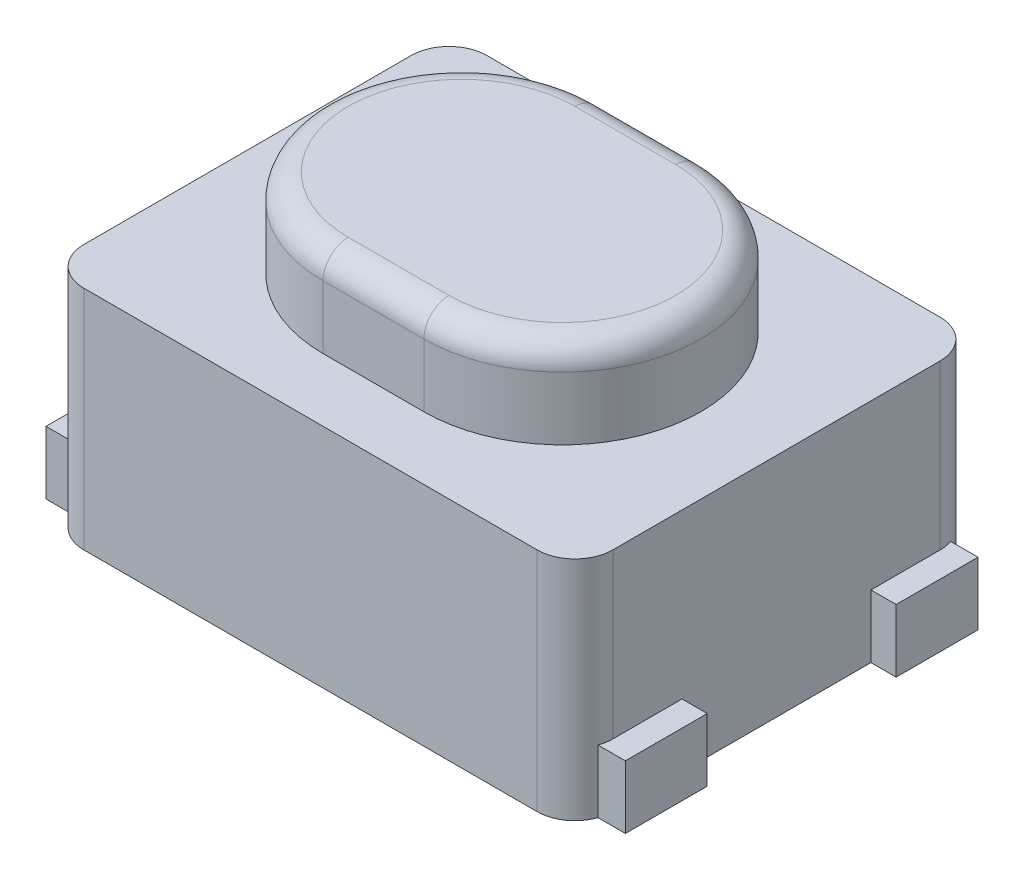
ISO-10303-21;
HEADER;
FILE_DESCRIPTION(('STEP AP214'),'2;1');
FILE_NAME('part.step','',(''),(''),'','','');
FILE_SCHEMA(('AUTOMOTIVE_DESIGN { 1 0 10303 214 1 1 1 1 }'));
ENDSEC;
DATA;
#1=APPLICATION_CONTEXT('core data for automotive mechanical design processes');
#2=APPLICATION_PROTOCOL_DEFINITION('international standard','automotive_design',2000,#1);
#3=PRODUCT_CONTEXT('',#1,'mechanical');
#4=PRODUCT('Part','Part','',(#3));
#5=PRODUCT_RELATED_PRODUCT_CATEGORY('part','',(#4));
#6=PRODUCT_DEFINITION_FORMATION('','',#4);
#7=PRODUCT_DEFINITION_CONTEXT('part definition',#1,'design');
#8=PRODUCT_DEFINITION('design','',#6,#7);
#9=PRODUCT_DEFINITION_SHAPE('','',#8);
#10=(LENGTH_UNIT() NAMED_UNIT(*) SI_UNIT(.MILLI.,.METRE.));
#11=(NAMED_UNIT(*) PLANE_ANGLE_UNIT() SI_UNIT($,.RADIAN.));
#12=(NAMED_UNIT(*) SI_UNIT($,.STERADIAN.) SOLID_ANGLE_UNIT());
#13=UNCERTAINTY_MEASURE_WITH_UNIT(LENGTH_MEASURE(1.E-05),#10,'distance_accuracy_value','');
#14=(GEOMETRIC_REPRESENTATION_CONTEXT(3) GLOBAL_UNCERTAINTY_ASSIGNED_CONTEXT((#13)) GLOBAL_UNIT_ASSIGNED_CONTEXT((#10,
#11,#12)) REPRESENTATION_CONTEXT('',''));
#15=CARTESIAN_POINT('',(0.,0.,0.));
#16=DIRECTION('',(0.,0.,1.));
#17=DIRECTION('',(1.,0.,0.));
#18=AXIS2_PLACEMENT_3D('',#15,#16,#17);
#19=CARTESIAN_POINT('',(2.1,1.8,-1.3));
#20=DIRECTION('',(-1.,0.,0.));
#21=DIRECTION('',(0.,0.,1.));
#22=AXIS2_PLACEMENT_3D('',#19,#20,#21);
#23=PLANE('',#22);
#24=DIRECTION('',(0.,1.,0.));
#25=VECTOR('',#24,1.);
#26=CARTESIAN_POINT('',(2.1,1.8,0.75));
#27=LINE('',#26,#25);
#28=CARTESIAN_POINT('',(2.1,0.,0.75));
#29=VERTEX_POINT('',#28);
#30=CARTESIAN_POINT('',(2.1,0.5,0.75));
#31=VERTEX_POINT('',#30);
#32=EDGE_CURVE('E319',#29,#31,#27,.T.);
#33=ORIENTED_EDGE('',*,*,#32,.F.);
#34=DIRECTION('',(0.,0.,-1.));
#35=VECTOR('',#34,1.);
#36=CARTESIAN_POINT('',(2.1,0.,-1.3));
#37=LINE('',#36,#35);
#38=CARTESIAN_POINT('',(2.1,0.,-0.75));
#39=VERTEX_POINT('',#38);
#40=EDGE_CURVE('E402',#29,#39,#37,.T.);
#41=ORIENTED_EDGE('',*,*,#40,.T.);
#42=DIRECTION('',(0.,-1.,0.));
#43=VECTOR('',#42,1.);
#44=CARTESIAN_POINT('',(2.1,1.8,-0.75));
#45=LINE('',#44,#43);
#46=CARTESIAN_POINT('',(2.1,0.5,-0.75));
#47=VERTEX_POINT('',#46);
#48=EDGE_CURVE('E347',#47,#39,#45,.T.);
#49=ORIENTED_EDGE('',*,*,#48,.F.);
#50=DIRECTION('',(0.,0.,-1.));
#51=VECTOR('',#50,1.);
#52=CARTESIAN_POINT('',(2.1,0.5,-1.3));
#53=LINE('',#52,#51);
#54=CARTESIAN_POINT('',(2.1,0.5,-1.3));
#55=VERTEX_POINT('',#54);
#56=EDGE_CURVE('E353',#47,#55,#53,.T.);
#57=ORIENTED_EDGE('',*,*,#56,.T.);
#58=DIRECTION('',(0.,-1.,0.));
#59=VECTOR('',#58,1.);
#60=CARTESIAN_POINT('',(2.1,1.8,-1.3));
#61=LINE('',#60,#59);
#62=CARTESIAN_POINT('',(2.1,1.8,-1.3));
#63=VERTEX_POINT('',#62);
#64=EDGE_CURVE('E421',#63,#55,#61,.T.);
#65=ORIENTED_EDGE('',*,*,#64,.F.);
#66=DIRECTION('',(0.,0.,-1.));
#67=VECTOR('',#66,1.);
#68=CARTESIAN_POINT('',(2.1,1.8,-1.3));
#69=LINE('',#68,#67);
#70=CARTESIAN_POINT('',(2.1,1.8,1.3));
#71=VERTEX_POINT('',#70);
#72=EDGE_CURVE('E386',#71,#63,#69,.T.);
#73=ORIENTED_EDGE('',*,*,#72,.F.);
#74=DIRECTION('',(0.,-1.,0.));
#75=VECTOR('',#74,1.);
#76=CARTESIAN_POINT('',(2.1,1.8,1.3));
#77=LINE('',#76,#75);
#78=CARTESIAN_POINT('',(2.1,0.5,1.3));
#79=VERTEX_POINT('',#78);
#80=EDGE_CURVE('E424',#71,#79,#77,.T.);
#81=ORIENTED_EDGE('',*,*,#80,.T.);
#82=DIRECTION('',(0.,0.,1.));
#83=VECTOR('',#82,1.);
#84=CARTESIAN_POINT('',(2.1,0.5,-1.3));
#85=LINE('',#84,#83);
#86=EDGE_CURVE('E322',#31,#79,#85,.T.);
#87=ORIENTED_EDGE('',*,*,#86,.F.);
#88=EDGE_LOOP('',(#33,#41,#49,#57,#65,#73,#81,#87));
#89=FACE_BOUND('',#88,.T.);
#90=ADVANCED_FACE('F34',(#89),#23,.F.);
#91=CARTESIAN_POINT('',(1.8,1.8,1.3));
#92=DIRECTION('',(0.,-1.,0.));
#93=DIRECTION('',(0.,0.,-1.));
#94=AXIS2_PLACEMENT_3D('',#91,#92,#93);
#95=CYLINDRICAL_SURFACE('',#94,0.299999999999999);
#96=DIRECTION('',(0.,-1.,0.));
#97=VECTOR('',#96,1.);
#98=CARTESIAN_POINT('',(2.08284271247462,1.8,1.4));
#99=LINE('',#98,#97);
#100=CARTESIAN_POINT('',(2.08284271247462,0.5,1.4));
#101=VERTEX_POINT('',#100);
#102=CARTESIAN_POINT('',(2.08284271247462,0.,1.4));
#103=VERTEX_POINT('',#102);
#104=EDGE_CURVE('E316',#101,#103,#99,.T.);
#105=ORIENTED_EDGE('',*,*,#104,.F.);
#106=CARTESIAN_POINT('',(1.8,0.5,1.3));
#107=DIRECTION('',(0.,-1.,0.));
#108=DIRECTION('',(0.,0.,-1.));
#109=AXIS2_PLACEMENT_3D('',#106,#107,#108);
#110=CIRCLE('',#109,0.299999999999999);
#111=EDGE_CURVE('E461',#79,#101,#110,.T.);
#112=ORIENTED_EDGE('',*,*,#111,.F.);
#113=ORIENTED_EDGE('',*,*,#80,.F.);
#114=CARTESIAN_POINT('',(1.8,1.8,1.3));
#115=DIRECTION('',(0.,1.,0.));
#116=DIRECTION('',(0.,0.,1.));
#117=AXIS2_PLACEMENT_3D('',#114,#115,#116);
#118=CIRCLE('',#117,0.299999999999999);
#119=CARTESIAN_POINT('',(1.8,1.8,1.6));
#120=VERTEX_POINT('',#119);
#121=EDGE_CURVE('E384',#120,#71,#118,.T.);
#122=ORIENTED_EDGE('',*,*,#121,.F.);
#123=DIRECTION('',(0.,-1.,0.));
#124=VECTOR('',#123,1.);
#125=CARTESIAN_POINT('',(1.8,1.8,1.6));
#126=LINE('',#125,#124);
#127=CARTESIAN_POINT('',(1.8,0.,1.6));
#128=VERTEX_POINT('',#127);
#129=EDGE_CURVE('E427',#120,#128,#126,.T.);
#130=ORIENTED_EDGE('',*,*,#129,.T.);
#131=CARTESIAN_POINT('',(1.8,0.,1.3));
#132=DIRECTION('',(0.,1.,0.));
#133=DIRECTION('',(0.,0.,1.));
#134=AXIS2_PLACEMENT_3D('',#131,#132,#133);
#135=CIRCLE('',#134,0.299999999999999);
#136=EDGE_CURVE('E400',#128,#103,#135,.T.);
#137=ORIENTED_EDGE('',*,*,#136,.T.);
#138=EDGE_LOOP('',(#105,#112,#113,#122,#130,#137));
#139=FACE_BOUND('',#138,.T.);
#140=ADVANCED_FACE('F535',(#139),#95,.T.);
#141=CARTESIAN_POINT('',(1.8,1.8,-1.3));
#142=DIRECTION('',(0.,-1.,0.));
#143=DIRECTION('',(0.,0.,-1.));
#144=AXIS2_PLACEMENT_3D('',#141,#142,#143);
#145=CYLINDRICAL_SURFACE('',#144,0.299999999999999);
#146=DIRECTION('',(0.,-1.,0.));
#147=VECTOR('',#146,1.);
#148=CARTESIAN_POINT('',(2.08284271247462,1.8,-1.4));
#149=LINE('',#148,#147);
#150=CARTESIAN_POINT('',(2.08284271247462,0.,-1.4));
#151=VERTEX_POINT('',#150);
#152=CARTESIAN_POINT('',(2.08284271247462,0.5,-1.4));
#153=VERTEX_POINT('',#152);
#154=EDGE_CURVE('E350',#151,#153,#149,.F.);
#155=ORIENTED_EDGE('',*,*,#154,.F.);
#156=CARTESIAN_POINT('',(1.8,0.,-1.3));
#157=DIRECTION('',(0.,1.,0.));
#158=DIRECTION('',(0.,0.,-1.));
#159=AXIS2_PLACEMENT_3D('',#156,#157,#158);
#160=CIRCLE('',#159,0.299999999999999);
#161=CARTESIAN_POINT('',(1.8,0.,-1.6));
#162=VERTEX_POINT('',#161);
#163=EDGE_CURVE('E404',#151,#162,#160,.T.);
#164=ORIENTED_EDGE('',*,*,#163,.T.);
#165=DIRECTION('',(0.,-1.,0.));
#166=VECTOR('',#165,1.);
#167=CARTESIAN_POINT('',(1.8,1.8,-1.6));
#168=LINE('',#167,#166);
#169=CARTESIAN_POINT('',(1.8,1.8,-1.6));
#170=VERTEX_POINT('',#169);
#171=EDGE_CURVE('E418',#170,#162,#168,.T.);
#172=ORIENTED_EDGE('',*,*,#171,.F.);
#173=CARTESIAN_POINT('',(1.8,1.8,-1.3));
#174=DIRECTION('',(0.,1.,0.));
#175=DIRECTION('',(0.,0.,-1.));
#176=AXIS2_PLACEMENT_3D('',#173,#174,#175);
#177=CIRCLE('',#176,0.299999999999999);
#178=EDGE_CURVE('E388',#63,#170,#177,.T.);
#179=ORIENTED_EDGE('',*,*,#178,.F.);
#180=ORIENTED_EDGE('',*,*,#64,.T.);
#181=CARTESIAN_POINT('',(1.8,0.5,-1.3));
#182=DIRECTION('',(0.,1.,0.));
#183=DIRECTION('',(0.,0.,1.));
#184=AXIS2_PLACEMENT_3D('',#181,#182,#183);
#185=CIRCLE('',#184,0.299999999999999);
#186=EDGE_CURVE('E451',#55,#153,#185,.T.);
#187=ORIENTED_EDGE('',*,*,#186,.T.);
#188=EDGE_LOOP('',(#155,#164,#172,#179,#180,#187));
#189=FACE_BOUND('',#188,.T.);
#190=ADVANCED_FACE('F501',(#189),#145,.T.);
#191=CARTESIAN_POINT('',(-1.8,1.8,1.3));
#192=DIRECTION('',(0.,1.,0.));
#193=DIRECTION('',(0.,0.,1.));
#194=AXIS2_PLACEMENT_3D('',#191,#192,#193);
#195=PLANE('',#194);
#196=CARTESIAN_POINT('',(-1.8,1.8,1.3));
#197=DIRECTION('',(0.,1.,0.));
#198=DIRECTION('',(0.,0.,1.));
#199=AXIS2_PLACEMENT_3D('',#196,#197,#198);
#200=CIRCLE('',#199,0.299999999999999);
#201=CARTESIAN_POINT('',(-2.1,1.8,1.3));
#202=VERTEX_POINT('',#201);
#203=CARTESIAN_POINT('',(-1.8,1.8,1.6));
#204=VERTEX_POINT('',#203);
#205=EDGE_CURVE('E378',#202,#204,#200,.T.);
#206=ORIENTED_EDGE('',*,*,#205,.T.);
#207=DIRECTION('',(1.,0.,0.));
#208=VECTOR('',#207,1.);
#209=CARTESIAN_POINT('',(-1.8,1.8,1.6));
#210=LINE('',#209,#208);
#211=EDGE_CURVE('E381',#204,#120,#210,.T.);
#212=ORIENTED_EDGE('',*,*,#211,.T.);
#213=ORIENTED_EDGE('',*,*,#121,.T.);
#214=ORIENTED_EDGE('',*,*,#72,.T.);
#215=ORIENTED_EDGE('',*,*,#178,.T.);
#216=DIRECTION('',(-1.,0.,0.));
#217=VECTOR('',#216,1.);
#218=CARTESIAN_POINT('',(-1.8,1.8,-1.6));
#219=LINE('',#218,#217);
#220=CARTESIAN_POINT('',(-1.8,1.8,-1.6));
#221=VERTEX_POINT('',#220);
#222=EDGE_CURVE('E390',#170,#221,#219,.T.);
#223=ORIENTED_EDGE('',*,*,#222,.T.);
#224=CARTESIAN_POINT('',(-1.8,1.8,-1.3));
#225=DIRECTION('',(0.,1.,0.));
#226=DIRECTION('',(0.,0.,1.));
#227=AXIS2_PLACEMENT_3D('',#224,#225,#226);
#228=CIRCLE('',#227,0.299999999999999);
#229=CARTESIAN_POINT('',(-2.1,1.8,-1.3));
#230=VERTEX_POINT('',#229);
#231=EDGE_CURVE('E392',#221,#230,#228,.T.);
#232=ORIENTED_EDGE('',*,*,#231,.T.);
#233=DIRECTION('',(0.,0.,1.));
#234=VECTOR('',#233,1.);
#235=CARTESIAN_POINT('',(-2.1,1.8,-1.3));
#236=LINE('',#235,#234);
#237=EDGE_CURVE('E394',#230,#202,#236,.T.);
#238=ORIENTED_EDGE('',*,*,#237,.T.);
#239=EDGE_LOOP('',(#206,#212,#213,#214,#215,#223,#232,#238));
#240=FACE_BOUND('',#239,.T.);
#241=DIRECTION('',(-1.,0.,0.));
#242=VECTOR('',#241,1.);
#243=CARTESIAN_POINT('',(-1.8,1.8,1.1));
#244=LINE('',#243,#242);
#245=CARTESIAN_POINT('',(0.4,1.8,1.1));
#246=VERTEX_POINT('',#245);
#247=CARTESIAN_POINT('',(-0.4,1.8,1.1));
#248=VERTEX_POINT('',#247);
#249=EDGE_CURVE('E371',#246,#248,#244,.T.);
#250=ORIENTED_EDGE('',*,*,#249,.T.);
#251=CARTESIAN_POINT('',(-0.4,1.8,0.));
#252=DIRECTION('',(0.,1.,0.));
#253=DIRECTION('',(0.,0.,1.));
#254=AXIS2_PLACEMENT_3D('',#251,#252,#253);
#255=CIRCLE('',#254,1.1);
#256=CARTESIAN_POINT('',(-0.4,1.8,-1.1));
#257=VERTEX_POINT('',#256);
#258=EDGE_CURVE('E374',#248,#257,#255,.F.);
#259=ORIENTED_EDGE('',*,*,#258,.T.);
#260=DIRECTION('',(1.,0.,0.));
#261=VECTOR('',#260,1.);
#262=CARTESIAN_POINT('',(-1.8,1.8,-1.1));
#263=LINE('',#262,#261);
#264=CARTESIAN_POINT('',(0.4,1.8,-1.1));
#265=VERTEX_POINT('',#264);
#266=EDGE_CURVE('E365',#257,#265,#263,.T.);
#267=ORIENTED_EDGE('',*,*,#266,.T.);
#268=CARTESIAN_POINT('',(0.4,1.8,0.));
#269=DIRECTION('',(0.,1.,0.));
#270=DIRECTION('',(0.,0.,1.));
#271=AXIS2_PLACEMENT_3D('',#268,#269,#270);
#272=CIRCLE('',#271,1.1);
#273=EDGE_CURVE('E368',#265,#246,#272,.F.);
#274=ORIENTED_EDGE('',*,*,#273,.T.);
#275=EDGE_LOOP('',(#250,#259,#267,#274));
#276=FACE_BOUND('',#275,.T.);
#277=ADVANCED_FACE('F552',(#240,#276),#195,.T.);
#278=CARTESIAN_POINT('',(-1.8,1.8,1.3));
#279=DIRECTION('',(0.,-1.,0.));
#280=DIRECTION('',(0.,0.,-1.));
#281=AXIS2_PLACEMENT_3D('',#278,#279,#280);
#282=CYLINDRICAL_SURFACE('',#281,0.299999999999999);
#283=CARTESIAN_POINT('',(-1.8,0.5,1.3));
#284=DIRECTION('',(0.,-1.,0.));
#285=DIRECTION('',(0.,0.,-1.));
#286=AXIS2_PLACEMENT_3D('',#283,#284,#285);
#287=CIRCLE('',#286,0.299999999999999);
#288=CARTESIAN_POINT('',(-2.08284271247462,0.5,1.4));
#289=VERTEX_POINT('',#288);
#290=CARTESIAN_POINT('',(-2.1,0.5,1.3));
#291=VERTEX_POINT('',#290);
#292=EDGE_CURVE('E49',#289,#291,#287,.T.);
#293=ORIENTED_EDGE('',*,*,#292,.F.);
#294=DIRECTION('',(0.,-1.,0.));
#295=VECTOR('',#294,1.);
#296=CARTESIAN_POINT('',(-2.08284271247462,1.8,1.4));
#297=LINE('',#296,#295);
#298=CARTESIAN_POINT('',(-2.08284271247462,0.,1.4));
#299=VERTEX_POINT('',#298);
#300=EDGE_CURVE('E237',#289,#299,#297,.T.);
#301=ORIENTED_EDGE('',*,*,#300,.T.);
#302=CARTESIAN_POINT('',(-1.8,0.,1.3));
#303=DIRECTION('',(0.,1.,0.));
#304=DIRECTION('',(0.,0.,1.));
#305=AXIS2_PLACEMENT_3D('',#302,#303,#304);
#306=CIRCLE('',#305,0.299999999999999);
#307=CARTESIAN_POINT('',(-1.8,0.,1.6));
#308=VERTEX_POINT('',#307);
#309=EDGE_CURVE('E377',#299,#308,#306,.T.);
#310=ORIENTED_EDGE('',*,*,#309,.T.);
#311=DIRECTION('',(0.,-1.,0.));
#312=VECTOR('',#311,1.);
#313=CARTESIAN_POINT('',(-1.8,1.8,1.6));
#314=LINE('',#313,#312);
#315=EDGE_CURVE('E430',#204,#308,#314,.T.);
#316=ORIENTED_EDGE('',*,*,#315,.F.);
#317=ORIENTED_EDGE('',*,*,#205,.F.);
#318=DIRECTION('',(0.,-1.,0.));
#319=VECTOR('',#318,1.);
#320=CARTESIAN_POINT('',(-2.1,1.8,1.3));
#321=LINE('',#320,#319);
#322=EDGE_CURVE('E396',#202,#291,#321,.T.);
#323=ORIENTED_EDGE('',*,*,#322,.T.);
#324=EDGE_LOOP('',(#293,#301,#310,#316,#317,#323));
#325=FACE_BOUND('',#324,.T.);
#326=ADVANCED_FACE('F548',(#325),#282,.T.);
#327=CARTESIAN_POINT('',(-1.8,1.8,1.6));
#328=DIRECTION('',(0.,0.,-1.));
#329=DIRECTION('',(-1.,0.,0.));
#330=AXIS2_PLACEMENT_3D('',#327,#328,#329);
#331=PLANE('',#330);
#332=DIRECTION('',(1.,0.,0.));
#333=VECTOR('',#332,1.);
#334=CARTESIAN_POINT('',(-1.8,0.,1.6));
#335=LINE('',#334,#333);
#336=EDGE_CURVE('E398',#308,#128,#335,.T.);
#337=ORIENTED_EDGE('',*,*,#336,.T.);
#338=ORIENTED_EDGE('',*,*,#129,.F.);
#339=ORIENTED_EDGE('',*,*,#211,.F.);
#340=ORIENTED_EDGE('',*,*,#315,.T.);
#341=EDGE_LOOP('',(#337,#338,#339,#340));
#342=FACE_BOUND('',#341,.T.);
#343=ADVANCED_FACE('F545',(#342),#331,.F.);
#344=CARTESIAN_POINT('',(-1.8,1.8,-1.6));
#345=DIRECTION('',(0.,0.,1.));
#346=DIRECTION('',(1.,0.,0.));
#347=AXIS2_PLACEMENT_3D('',#344,#345,#346);
#348=PLANE('',#347);
#349=DIRECTION('',(-1.,0.,0.));
#350=VECTOR('',#349,1.);
#351=CARTESIAN_POINT('',(-1.8,0.,-1.6));
#352=LINE('',#351,#350);
#353=CARTESIAN_POINT('',(-1.8,0.,-1.6));
#354=VERTEX_POINT('',#353);
#355=EDGE_CURVE('E406',#162,#354,#352,.T.);
#356=ORIENTED_EDGE('',*,*,#355,.T.);
#357=DIRECTION('',(0.,-1.,0.));
#358=VECTOR('',#357,1.);
#359=CARTESIAN_POINT('',(-1.8,1.8,-1.6));
#360=LINE('',#359,#358);
#361=EDGE_CURVE('E415',#221,#354,#360,.T.);
#362=ORIENTED_EDGE('',*,*,#361,.F.);
#363=ORIENTED_EDGE('',*,*,#222,.F.);
#364=ORIENTED_EDGE('',*,*,#171,.T.);
#365=EDGE_LOOP('',(#356,#362,#363,#364));
#366=FACE_BOUND('',#365,.T.);
#367=ADVANCED_FACE('F496',(#366),#348,.F.);
#368=CARTESIAN_POINT('',(-1.8,1.8,-1.3));
#369=DIRECTION('',(0.,-1.,0.));
#370=DIRECTION('',(0.,0.,-1.));
#371=AXIS2_PLACEMENT_3D('',#368,#369,#370);
#372=CYLINDRICAL_SURFACE('',#371,0.299999999999999);
#373=CARTESIAN_POINT('',(-1.8,0.,-1.3));
#374=DIRECTION('',(0.,1.,0.));
#375=DIRECTION('',(0.,0.,1.));
#376=AXIS2_PLACEMENT_3D('',#373,#374,#375);
#377=CIRCLE('',#376,0.299999999999999);
#378=CARTESIAN_POINT('',(-2.08284271247462,0.,-1.4));
#379=VERTEX_POINT('',#378);
#380=EDGE_CURVE('E408',#354,#379,#377,.T.);
#381=ORIENTED_EDGE('',*,*,#380,.T.);
#382=DIRECTION('',(0.,-1.,0.));
#383=VECTOR('',#382,1.);
#384=CARTESIAN_POINT('',(-2.08284271247462,1.8,-1.4));
#385=LINE('',#384,#383);
#386=CARTESIAN_POINT('',(-2.08284271247462,0.5,-1.4));
#387=VERTEX_POINT('',#386);
#388=EDGE_CURVE('E287',#379,#387,#385,.F.);
#389=ORIENTED_EDGE('',*,*,#388,.T.);
#390=CARTESIAN_POINT('',(-1.8,0.5,-1.3));
#391=DIRECTION('',(0.,1.,0.));
#392=DIRECTION('',(0.,0.,1.));
#393=AXIS2_PLACEMENT_3D('',#390,#391,#392);
#394=CIRCLE('',#393,0.299999999999999);
#395=CARTESIAN_POINT('',(-2.1,0.5,-1.3));
#396=VERTEX_POINT('',#395);
#397=EDGE_CURVE('E292',#387,#396,#394,.T.);
#398=ORIENTED_EDGE('',*,*,#397,.T.);
#399=DIRECTION('',(0.,-1.,0.));
#400=VECTOR('',#399,1.);
#401=CARTESIAN_POINT('',(-2.1,1.8,-1.3));
#402=LINE('',#401,#400);
#403=EDGE_CURVE('E412',#230,#396,#402,.T.);
#404=ORIENTED_EDGE('',*,*,#403,.F.);
#405=ORIENTED_EDGE('',*,*,#231,.F.);
#406=ORIENTED_EDGE('',*,*,#361,.T.);
#407=EDGE_LOOP('',(#381,#389,#398,#404,#405,#406));
#408=FACE_BOUND('',#407,.T.);
#409=ADVANCED_FACE('F490',(#408),#372,.T.);
#410=CARTESIAN_POINT('',(-2.1,1.8,-1.3));
#411=DIRECTION('',(1.,0.,0.));
#412=DIRECTION('',(0.,0.,-1.));
#413=AXIS2_PLACEMENT_3D('',#410,#411,#412);
#414=PLANE('',#413);
#415=DIRECTION('',(0.,0.,1.));
#416=VECTOR('',#415,1.);
#417=CARTESIAN_POINT('',(-2.1,0.,-1.3));
#418=LINE('',#417,#416);
#419=CARTESIAN_POINT('',(-2.1,0.,-0.75));
#420=VERTEX_POINT('',#419);
#421=CARTESIAN_POINT('',(-2.1,0.,0.75));
#422=VERTEX_POINT('',#421);
#423=EDGE_CURVE('E382',#420,#422,#418,.T.);
#424=ORIENTED_EDGE('',*,*,#423,.T.);
#425=DIRECTION('',(0.,1.,0.));
#426=VECTOR('',#425,1.);
#427=CARTESIAN_POINT('',(-2.1,1.8,0.75));
#428=LINE('',#427,#426);
#429=CARTESIAN_POINT('',(-2.1,0.5,0.75));
#430=VERTEX_POINT('',#429);
#431=EDGE_CURVE('E57',#422,#430,#428,.T.);
#432=ORIENTED_EDGE('',*,*,#431,.T.);
#433=DIRECTION('',(0.,0.,-1.));
#434=VECTOR('',#433,1.);
#435=CARTESIAN_POINT('',(-2.1,0.5,-1.3));
#436=LINE('',#435,#434);
#437=EDGE_CURVE('E11',#291,#430,#436,.T.);
#438=ORIENTED_EDGE('',*,*,#437,.F.);
#439=ORIENTED_EDGE('',*,*,#322,.F.);
#440=ORIENTED_EDGE('',*,*,#237,.F.);
#441=ORIENTED_EDGE('',*,*,#403,.T.);
#442=DIRECTION('',(0.,0.,1.));
#443=VECTOR('',#442,1.);
#444=CARTESIAN_POINT('',(-2.1,0.5,-1.3));
#445=LINE('',#444,#443);
#446=CARTESIAN_POINT('',(-2.1,0.5,-0.75));
#447=VERTEX_POINT('',#446);
#448=EDGE_CURVE('E42',#396,#447,#445,.T.);
#449=ORIENTED_EDGE('',*,*,#448,.T.);
#450=DIRECTION('',(0.,-1.,0.));
#451=VECTOR('',#450,1.);
#452=CARTESIAN_POINT('',(-2.1,1.8,-0.75));
#453=LINE('',#452,#451);
#454=EDGE_CURVE('E289',#447,#420,#453,.T.);
#455=ORIENTED_EDGE('',*,*,#454,.T.);
#456=EDGE_LOOP('',(#424,#432,#438,#439,#440,#441,#449,#455));
#457=FACE_BOUND('',#456,.T.);
#458=ADVANCED_FACE('F465',(#457),#414,.F.);
#459=CARTESIAN_POINT('',(-1.8,0.,1.3));
#460=DIRECTION('',(0.,1.,0.));
#461=DIRECTION('',(0.,0.,1.));
#462=AXIS2_PLACEMENT_3D('',#459,#460,#461);
#463=PLANE('',#462);
#464=ORIENTED_EDGE('',*,*,#309,.F.);
#465=DIRECTION('',(-1.,0.,0.));
#466=VECTOR('',#465,1.);
#467=CARTESIAN_POINT('',(-2.3,0.,1.4));
#468=LINE('',#467,#466);
#469=CARTESIAN_POINT('',(-2.3,0.,1.4));
#470=VERTEX_POINT('',#469);
#471=EDGE_CURVE('E256',#299,#470,#468,.T.);
#472=ORIENTED_EDGE('',*,*,#471,.T.);
#473=DIRECTION('',(0.,0.,-1.));
#474=VECTOR('',#473,1.);
#475=CARTESIAN_POINT('',(-2.3,0.,0.75));
#476=LINE('',#475,#474);
#477=CARTESIAN_POINT('',(-2.3,0.,0.75));
#478=VERTEX_POINT('',#477);
#479=EDGE_CURVE('E248',#470,#478,#476,.T.);
#480=ORIENTED_EDGE('',*,*,#479,.T.);
#481=DIRECTION('',(1.,0.,0.));
#482=VECTOR('',#481,1.);
#483=CARTESIAN_POINT('',(-2.3,0.,0.75));
#484=LINE('',#483,#482);
#485=EDGE_CURVE('E253',#478,#422,#484,.T.);
#486=ORIENTED_EDGE('',*,*,#485,.T.);
#487=ORIENTED_EDGE('',*,*,#423,.F.);
#488=DIRECTION('',(-1.,0.,0.));
#489=VECTOR('',#488,1.);
#490=CARTESIAN_POINT('',(-2.3,0.,-0.75));
#491=LINE('',#490,#489);
#492=CARTESIAN_POINT('',(-2.3,0.,-0.75));
#493=VERTEX_POINT('',#492);
#494=EDGE_CURVE('E279',#420,#493,#491,.T.);
#495=ORIENTED_EDGE('',*,*,#494,.T.);
#496=DIRECTION('',(0.,0.,-1.));
#497=VECTOR('',#496,1.);
#498=CARTESIAN_POINT('',(-2.3,0.,-0.75));
#499=LINE('',#498,#497);
#500=CARTESIAN_POINT('',(-2.3,0.,-1.4));
#501=VERTEX_POINT('',#500);
#502=EDGE_CURVE('E266',#493,#501,#499,.T.);
#503=ORIENTED_EDGE('',*,*,#502,.T.);
#504=DIRECTION('',(1.,0.,0.));
#505=VECTOR('',#504,1.);
#506=CARTESIAN_POINT('',(-2.3,0.,-1.4));
#507=LINE('',#506,#505);
#508=EDGE_CURVE('E271',#501,#379,#507,.T.);
#509=ORIENTED_EDGE('',*,*,#508,.T.);
#510=ORIENTED_EDGE('',*,*,#380,.F.);
#511=ORIENTED_EDGE('',*,*,#355,.F.);
#512=ORIENTED_EDGE('',*,*,#163,.F.);
#513=DIRECTION('',(-1.,0.,0.));
#514=VECTOR('',#513,1.);
#515=CARTESIAN_POINT('',(2.3,0.,-1.4));
#516=LINE('',#515,#514);
#517=CARTESIAN_POINT('',(2.3,0.,-1.4));
#518=VERTEX_POINT('',#517);
#519=EDGE_CURVE('E338',#518,#151,#516,.T.);
#520=ORIENTED_EDGE('',*,*,#519,.F.);
#521=DIRECTION('',(0.,0.,-1.));
#522=VECTOR('',#521,1.);
#523=CARTESIAN_POINT('',(2.3,0.,-0.75));
#524=LINE('',#523,#522);
#525=CARTESIAN_POINT('',(2.3,0.,-0.75));
#526=VERTEX_POINT('',#525);
#527=EDGE_CURVE('E325',#526,#518,#524,.T.);
#528=ORIENTED_EDGE('',*,*,#527,.F.);
#529=DIRECTION('',(1.,0.,0.));
#530=VECTOR('',#529,1.);
#531=CARTESIAN_POINT('',(2.3,0.,-0.75));
#532=LINE('',#531,#530);
#533=EDGE_CURVE('E330',#39,#526,#532,.T.);
#534=ORIENTED_EDGE('',*,*,#533,.F.);
#535=ORIENTED_EDGE('',*,*,#40,.F.);
#536=DIRECTION('',(-1.,0.,0.));
#537=VECTOR('',#536,1.);
#538=CARTESIAN_POINT('',(2.3,0.,0.75));
#539=LINE('',#538,#537);
#540=CARTESIAN_POINT('',(2.3,0.,0.75));
#541=VERTEX_POINT('',#540);
#542=EDGE_CURVE('E307',#541,#29,#539,.T.);
#543=ORIENTED_EDGE('',*,*,#542,.F.);
#544=DIRECTION('',(0.,0.,-1.));
#545=VECTOR('',#544,1.);
#546=CARTESIAN_POINT('',(2.3,0.,0.75));
#547=LINE('',#546,#545);
#548=CARTESIAN_POINT('',(2.3,0.,1.4));
#549=VERTEX_POINT('',#548);
#550=EDGE_CURVE('E294',#549,#541,#547,.T.);
#551=ORIENTED_EDGE('',*,*,#550,.F.);
#552=DIRECTION('',(1.,0.,0.));
#553=VECTOR('',#552,1.);
#554=CARTESIAN_POINT('',(2.3,0.,1.4));
#555=LINE('',#554,#553);
#556=EDGE_CURVE('E299',#103,#549,#555,.T.);
#557=ORIENTED_EDGE('',*,*,#556,.F.);
#558=ORIENTED_EDGE('',*,*,#136,.F.);
#559=ORIENTED_EDGE('',*,*,#336,.F.);
#560=EDGE_LOOP('',(#464,#472,#480,#486,#487,#495,#503,#509,#510,#511,#512,#520,#528,#534,#535,
#543,#551,#557,#558,#559));
#561=FACE_BOUND('',#560,.T.);
#562=ADVANCED_FACE('F484',(#561),#463,.F.);
#563=CARTESIAN_POINT('',(-0.4,2.5,0.));
#564=DIRECTION('',(0.,-1.,0.));
#565=DIRECTION('',(0.,0.,-1.));
#566=AXIS2_PLACEMENT_3D('',#563,#564,#565);
#567=CYLINDRICAL_SURFACE('',#566,1.1);
#568=DIRECTION('',(0.,-1.,0.));
#569=VECTOR('',#568,1.);
#570=CARTESIAN_POINT('',(-0.4,2.5,1.1));
#571=LINE('',#570,#569);
#572=CARTESIAN_POINT('',(-0.4,2.3,1.1));
#573=VERTEX_POINT('',#572);
#574=EDGE_CURVE('E363',#573,#248,#571,.T.);
#575=ORIENTED_EDGE('',*,*,#574,.F.);
#576=CARTESIAN_POINT('',(-0.4,2.3,0.));
#577=DIRECTION('',(0.,1.,0.));
#578=DIRECTION('',(0.,0.,1.));
#579=AXIS2_PLACEMENT_3D('',#576,#577,#578);
#580=CIRCLE('',#579,1.1);
#581=CARTESIAN_POINT('',(-0.4,2.3,-1.1));
#582=VERTEX_POINT('',#581);
#583=EDGE_CURVE('E449',#573,#582,#580,.F.);
#584=ORIENTED_EDGE('',*,*,#583,.T.);
#585=DIRECTION('',(0.,-1.,0.));
#586=VECTOR('',#585,1.);
#587=CARTESIAN_POINT('',(-0.4,2.5,-1.1));
#588=LINE('',#587,#586);
#589=EDGE_CURVE('E356',#582,#257,#588,.T.);
#590=ORIENTED_EDGE('',*,*,#589,.T.);
#591=ORIENTED_EDGE('',*,*,#258,.F.);
#592=EDGE_LOOP('',(#575,#584,#590,#591));
#593=FACE_BOUND('',#592,.T.);
#594=ADVANCED_FACE('F583',(#593),#567,.T.);
#595=CARTESIAN_POINT('',(-0.4,2.5,1.1));
#596=DIRECTION('',(0.,0.,-1.));
#597=DIRECTION('',(-1.,0.,0.));
#598=AXIS2_PLACEMENT_3D('',#595,#596,#597);
#599=PLANE('',#598);
#600=DIRECTION('',(0.,-1.,0.));
#601=VECTOR('',#600,1.);
#602=CARTESIAN_POINT('',(0.4,2.5,1.1));
#603=LINE('',#602,#601);
#604=CARTESIAN_POINT('',(0.4,2.3,1.1));
#605=VERTEX_POINT('',#604);
#606=EDGE_CURVE('E361',#605,#246,#603,.T.);
#607=ORIENTED_EDGE('',*,*,#606,.F.);
#608=DIRECTION('',(1.,0.,0.));
#609=VECTOR('',#608,1.);
#610=CARTESIAN_POINT('',(-0.4,2.3,1.1));
#611=LINE('',#610,#609);
#612=EDGE_CURVE('E447',#605,#573,#611,.F.);
#613=ORIENTED_EDGE('',*,*,#612,.T.);
#614=ORIENTED_EDGE('',*,*,#574,.T.);
#615=ORIENTED_EDGE('',*,*,#249,.F.);
#616=EDGE_LOOP('',(#607,#613,#614,#615));
#617=FACE_BOUND('',#616,.T.);
#618=ADVANCED_FACE('F579',(#617),#599,.F.);
#619=CARTESIAN_POINT('',(0.4,2.5,0.));
#620=DIRECTION('',(0.,-1.,0.));
#621=DIRECTION('',(0.,0.,-1.));
#622=AXIS2_PLACEMENT_3D('',#619,#620,#621);
#623=CYLINDRICAL_SURFACE('',#622,1.1);
#624=DIRECTION('',(0.,-1.,0.));
#625=VECTOR('',#624,1.);
#626=CARTESIAN_POINT('',(0.4,2.5,-1.1));
#627=LINE('',#626,#625);
#628=CARTESIAN_POINT('',(0.4,2.3,-1.1));
#629=VERTEX_POINT('',#628);
#630=EDGE_CURVE('E358',#629,#265,#627,.T.);
#631=ORIENTED_EDGE('',*,*,#630,.F.);
#632=CARTESIAN_POINT('',(0.4,2.3,0.));
#633=DIRECTION('',(0.,1.,0.));
#634=DIRECTION('',(0.,0.,1.));
#635=AXIS2_PLACEMENT_3D('',#632,#633,#634);
#636=CIRCLE('',#635,1.1);
#637=EDGE_CURVE('E445',#629,#605,#636,.F.);
#638=ORIENTED_EDGE('',*,*,#637,.T.);
#639=ORIENTED_EDGE('',*,*,#606,.T.);
#640=ORIENTED_EDGE('',*,*,#273,.F.);
#641=EDGE_LOOP('',(#631,#638,#639,#640));
#642=FACE_BOUND('',#641,.T.);
#643=ADVANCED_FACE('F590',(#642),#623,.T.);
#644=CARTESIAN_POINT('',(-0.4,2.5,-1.1));
#645=DIRECTION('',(0.,0.,1.));
#646=DIRECTION('',(1.,0.,0.));
#647=AXIS2_PLACEMENT_3D('',#644,#645,#646);
#648=PLANE('',#647);
#649=ORIENTED_EDGE('',*,*,#589,.F.);
#650=DIRECTION('',(-1.,0.,0.));
#651=VECTOR('',#650,1.);
#652=CARTESIAN_POINT('',(0.4,2.3,-1.1));
#653=LINE('',#652,#651);
#654=EDGE_CURVE('E442',#582,#629,#653,.F.);
#655=ORIENTED_EDGE('',*,*,#654,.T.);
#656=ORIENTED_EDGE('',*,*,#630,.T.);
#657=ORIENTED_EDGE('',*,*,#266,.F.);
#658=EDGE_LOOP('',(#649,#655,#656,#657));
#659=FACE_BOUND('',#658,.T.);
#660=ADVANCED_FACE('F592',(#659),#648,.F.);
#661=CARTESIAN_POINT('',(-0.4,2.5,0.));
#662=DIRECTION('',(0.,1.,0.));
#663=DIRECTION('',(0.,0.,1.));
#664=AXIS2_PLACEMENT_3D('',#661,#662,#663);
#665=PLANE('',#664);
#666=CARTESIAN_POINT('',(0.4,2.5,0.));
#667=DIRECTION('',(0.,1.,0.));
#668=DIRECTION('',(0.,0.,1.));
#669=AXIS2_PLACEMENT_3D('',#666,#667,#668);
#670=CIRCLE('',#669,0.9);
#671=CARTESIAN_POINT('',(0.4,2.5,0.9));
#672=VERTEX_POINT('',#671);
#673=CARTESIAN_POINT('',(0.4,2.5,-0.9));
#674=VERTEX_POINT('',#673);
#675=EDGE_CURVE('E437',#672,#674,#670,.T.);
#676=ORIENTED_EDGE('',*,*,#675,.T.);
#677=DIRECTION('',(-1.,0.,0.));
#678=VECTOR('',#677,1.);
#679=CARTESIAN_POINT('',(-0.4,2.5,-0.9));
#680=LINE('',#679,#678);
#681=CARTESIAN_POINT('',(-0.4,2.5,-0.9));
#682=VERTEX_POINT('',#681);
#683=EDGE_CURVE('E439',#674,#682,#680,.T.);
#684=ORIENTED_EDGE('',*,*,#683,.T.);
#685=CARTESIAN_POINT('',(-0.4,2.5,0.));
#686=DIRECTION('',(0.,1.,0.));
#687=DIRECTION('',(0.,0.,1.));
#688=AXIS2_PLACEMENT_3D('',#685,#686,#687);
#689=CIRCLE('',#688,0.9);
#690=CARTESIAN_POINT('',(-0.4,2.5,0.9));
#691=VERTEX_POINT('',#690);
#692=EDGE_CURVE('E433',#682,#691,#689,.T.);
#693=ORIENTED_EDGE('',*,*,#692,.T.);
#694=DIRECTION('',(1.,0.,0.));
#695=VECTOR('',#694,1.);
#696=CARTESIAN_POINT('',(0.4,2.5,0.9));
#697=LINE('',#696,#695);
#698=EDGE_CURVE('E435',#691,#672,#697,.T.);
#699=ORIENTED_EDGE('',*,*,#698,.T.);
#700=EDGE_LOOP('',(#676,#684,#693,#699));
#701=FACE_BOUND('',#700,.T.);
#702=ADVANCED_FACE('F566',(#701),#665,.T.);
#703=CARTESIAN_POINT('',(-0.4,2.3,0.9));
#704=DIRECTION('',(-1.,0.,0.));
#705=DIRECTION('',(0.,0.,1.));
#706=AXIS2_PLACEMENT_3D('',#703,#704,#705);
#707=CYLINDRICAL_SURFACE('',#706,0.2);
#708=CARTESIAN_POINT('',(-0.4,2.3,0.9));
#709=DIRECTION('',(-1.,0.,0.));
#710=DIRECTION('',(0.,0.,1.));
#711=AXIS2_PLACEMENT_3D('',#708,#709,#710);
#712=CIRCLE('',#711,0.2);
#713=EDGE_CURVE('E455',#573,#691,#712,.T.);
#714=ORIENTED_EDGE('',*,*,#713,.F.);
#715=ORIENTED_EDGE('',*,*,#612,.F.);
#716=CARTESIAN_POINT('',(0.4,2.3,0.9));
#717=DIRECTION('',(1.,0.,0.));
#718=DIRECTION('',(0.,0.,-1.));
#719=AXIS2_PLACEMENT_3D('',#716,#717,#718);
#720=CIRCLE('',#719,0.2);
#721=EDGE_CURVE('E359',#672,#605,#720,.T.);
#722=ORIENTED_EDGE('',*,*,#721,.F.);
#723=ORIENTED_EDGE('',*,*,#698,.F.);
#724=EDGE_LOOP('',(#714,#715,#722,#723));
#725=FACE_BOUND('',#724,.T.);
#726=ADVANCED_FACE('F36',(#725),#707,.T.);
#727=CARTESIAN_POINT('',(0.4,2.3,0.));
#728=DIRECTION('',(0.,1.,0.));
#729=DIRECTION('',(0.,0.,1.));
#730=AXIS2_PLACEMENT_3D('',#727,#728,#729);
#731=TOROIDAL_SURFACE('',#730,0.9,0.2);
#732=ORIENTED_EDGE('',*,*,#721,.T.);
#733=ORIENTED_EDGE('',*,*,#637,.F.);
#734=CARTESIAN_POINT('',(0.4,2.3,-0.9));
#735=DIRECTION('',(-1.,0.,0.));
#736=DIRECTION('',(0.,0.,1.));
#737=AXIS2_PLACEMENT_3D('',#734,#735,#736);
#738=CIRCLE('',#737,0.2);
#739=EDGE_CURVE('E453',#674,#629,#738,.T.);
#740=ORIENTED_EDGE('',*,*,#739,.F.);
#741=ORIENTED_EDGE('',*,*,#675,.F.);
#742=EDGE_LOOP('',(#732,#733,#740,#741));
#743=FACE_BOUND('',#742,.T.);
#744=ADVANCED_FACE('F559',(#743),#731,.T.);
#745=CARTESIAN_POINT('',(-0.4,2.3,0.));
#746=DIRECTION('',(0.,1.,0.));
#747=DIRECTION('',(0.,0.,1.));
#748=AXIS2_PLACEMENT_3D('',#745,#746,#747);
#749=TOROIDAL_SURFACE('',#748,0.9,0.2);
#750=ORIENTED_EDGE('',*,*,#713,.T.);
#751=ORIENTED_EDGE('',*,*,#692,.F.);
#752=CARTESIAN_POINT('',(-0.4,2.3,-0.9));
#753=DIRECTION('',(1.,0.,0.));
#754=DIRECTION('',(0.,0.,-1.));
#755=AXIS2_PLACEMENT_3D('',#752,#753,#754);
#756=CIRCLE('',#755,0.2);
#757=EDGE_CURVE('E355',#582,#682,#756,.T.);
#758=ORIENTED_EDGE('',*,*,#757,.F.);
#759=ORIENTED_EDGE('',*,*,#583,.F.);
#760=EDGE_LOOP('',(#750,#751,#758,#759));
#761=FACE_BOUND('',#760,.T.);
#762=ADVANCED_FACE('F556',(#761),#749,.T.);
#763=CARTESIAN_POINT('',(-0.4,2.3,-0.9));
#764=DIRECTION('',(1.,0.,0.));
#765=DIRECTION('',(0.,0.,-1.));
#766=AXIS2_PLACEMENT_3D('',#763,#764,#765);
#767=CYLINDRICAL_SURFACE('',#766,0.2);
#768=ORIENTED_EDGE('',*,*,#739,.T.);
#769=ORIENTED_EDGE('',*,*,#654,.F.);
#770=ORIENTED_EDGE('',*,*,#757,.T.);
#771=ORIENTED_EDGE('',*,*,#683,.F.);
#772=EDGE_LOOP('',(#768,#769,#770,#771));
#773=FACE_BOUND('',#772,.T.);
#774=ADVANCED_FACE('F553',(#773),#767,.T.);
#775=CARTESIAN_POINT('',(2.3,0.5,-1.4));
#776=DIRECTION('',(0.,0.,1.));
#777=DIRECTION('',(1.,0.,0.));
#778=AXIS2_PLACEMENT_3D('',#775,#776,#777);
#779=PLANE('',#778);
#780=ORIENTED_EDGE('',*,*,#519,.T.);
#781=ORIENTED_EDGE('',*,*,#154,.T.);
#782=DIRECTION('',(-1.,0.,0.));
#783=VECTOR('',#782,1.);
#784=CARTESIAN_POINT('',(2.3,0.5,-1.4));
#785=LINE('',#784,#783);
#786=CARTESIAN_POINT('',(2.3,0.5,-1.4));
#787=VERTEX_POINT('',#786);
#788=EDGE_CURVE('E329',#787,#153,#785,.T.);
#789=ORIENTED_EDGE('',*,*,#788,.F.);
#790=DIRECTION('',(0.,-1.,0.));
#791=VECTOR('',#790,1.);
#792=CARTESIAN_POINT('',(2.3,0.5,-1.4));
#793=LINE('',#792,#791);
#794=EDGE_CURVE('E344',#787,#518,#793,.T.);
#795=ORIENTED_EDGE('',*,*,#794,.T.);
#796=EDGE_LOOP('',(#780,#781,#789,#795));
#797=FACE_BOUND('',#796,.T.);
#798=ADVANCED_FACE('F504',(#797),#779,.F.);
#799=CARTESIAN_POINT('',(2.3,0.5,-0.75));
#800=DIRECTION('',(0.,0.,-1.));
#801=DIRECTION('',(-1.,0.,0.));
#802=AXIS2_PLACEMENT_3D('',#799,#800,#801);
#803=PLANE('',#802);
#804=DIRECTION('',(1.,0.,0.));
#805=VECTOR('',#804,1.);
#806=CARTESIAN_POINT('',(2.3,0.5,-0.75));
#807=LINE('',#806,#805);
#808=CARTESIAN_POINT('',(2.3,0.5,-0.75));
#809=VERTEX_POINT('',#808);
#810=EDGE_CURVE('E333',#47,#809,#807,.T.);
#811=ORIENTED_EDGE('',*,*,#810,.F.);
#812=ORIENTED_EDGE('',*,*,#48,.T.);
#813=ORIENTED_EDGE('',*,*,#533,.T.);
#814=DIRECTION('',(0.,-1.,0.));
#815=VECTOR('',#814,1.);
#816=CARTESIAN_POINT('',(2.3,0.5,-0.75));
#817=LINE('',#816,#815);
#818=EDGE_CURVE('E335',#809,#526,#817,.T.);
#819=ORIENTED_EDGE('',*,*,#818,.F.);
#820=EDGE_LOOP('',(#811,#812,#813,#819));
#821=FACE_BOUND('',#820,.T.);
#822=ADVANCED_FACE('F515',(#821),#803,.F.);
#823=CARTESIAN_POINT('',(2.3,0.5,-0.75));
#824=DIRECTION('',(-1.,0.,0.));
#825=DIRECTION('',(0.,0.,1.));
#826=AXIS2_PLACEMENT_3D('',#823,#824,#825);
#827=PLANE('',#826);
#828=ORIENTED_EDGE('',*,*,#527,.T.);
#829=ORIENTED_EDGE('',*,*,#794,.F.);
#830=DIRECTION('',(0.,0.,-1.));
#831=VECTOR('',#830,1.);
#832=CARTESIAN_POINT('',(2.3,0.5,-0.75));
#833=LINE('',#832,#831);
#834=EDGE_CURVE('E326',#809,#787,#833,.T.);
#835=ORIENTED_EDGE('',*,*,#834,.F.);
#836=ORIENTED_EDGE('',*,*,#818,.T.);
#837=EDGE_LOOP('',(#828,#829,#835,#836));
#838=FACE_BOUND('',#837,.T.);
#839=ADVANCED_FACE('F510',(#838),#827,.F.);
#840=CARTESIAN_POINT('',(0.,0.5,0.));
#841=DIRECTION('',(0.,1.,0.));
#842=DIRECTION('',(0.,0.,1.));
#843=AXIS2_PLACEMENT_3D('',#840,#841,#842);
#844=PLANE('',#843);
#845=ORIENTED_EDGE('',*,*,#56,.F.);
#846=ORIENTED_EDGE('',*,*,#810,.T.);
#847=ORIENTED_EDGE('',*,*,#834,.T.);
#848=ORIENTED_EDGE('',*,*,#788,.T.);
#849=ORIENTED_EDGE('',*,*,#186,.F.);
#850=EDGE_LOOP('',(#845,#846,#847,#848,#849));
#851=FACE_BOUND('',#850,.T.);
#852=ADVANCED_FACE('F520',(#851),#844,.T.);
#853=CARTESIAN_POINT('',(2.3,0.5,0.75));
#854=DIRECTION('',(0.,0.,1.));
#855=DIRECTION('',(1.,0.,0.));
#856=AXIS2_PLACEMENT_3D('',#853,#854,#855);
#857=PLANE('',#856);
#858=ORIENTED_EDGE('',*,*,#542,.T.);
#859=ORIENTED_EDGE('',*,*,#32,.T.);
#860=DIRECTION('',(-1.,0.,0.));
#861=VECTOR('',#860,1.);
#862=CARTESIAN_POINT('',(2.3,0.5,0.75));
#863=LINE('',#862,#861);
#864=CARTESIAN_POINT('',(2.3,0.5,0.75));
#865=VERTEX_POINT('',#864);
#866=EDGE_CURVE('E298',#865,#31,#863,.T.);
#867=ORIENTED_EDGE('',*,*,#866,.F.);
#868=DIRECTION('',(0.,-1.,0.));
#869=VECTOR('',#868,1.);
#870=CARTESIAN_POINT('',(2.3,0.5,0.75));
#871=LINE('',#870,#869);
#872=EDGE_CURVE('E313',#865,#541,#871,.T.);
#873=ORIENTED_EDGE('',*,*,#872,.T.);
#874=EDGE_LOOP('',(#858,#859,#867,#873));
#875=FACE_BOUND('',#874,.T.);
#876=ADVANCED_FACE('F522',(#875),#857,.F.);
#877=CARTESIAN_POINT('',(2.3,0.5,1.4));
#878=DIRECTION('',(0.,0.,-1.));
#879=DIRECTION('',(-1.,0.,0.));
#880=AXIS2_PLACEMENT_3D('',#877,#878,#879);
#881=PLANE('',#880);
#882=DIRECTION('',(1.,0.,0.));
#883=VECTOR('',#882,1.);
#884=CARTESIAN_POINT('',(2.3,0.5,1.4));
#885=LINE('',#884,#883);
#886=CARTESIAN_POINT('',(2.3,0.5,1.4));
#887=VERTEX_POINT('',#886);
#888=EDGE_CURVE('E302',#101,#887,#885,.T.);
#889=ORIENTED_EDGE('',*,*,#888,.F.);
#890=ORIENTED_EDGE('',*,*,#104,.T.);
#891=ORIENTED_EDGE('',*,*,#556,.T.);
#892=DIRECTION('',(0.,-1.,0.));
#893=VECTOR('',#892,1.);
#894=CARTESIAN_POINT('',(2.3,0.5,1.4));
#895=LINE('',#894,#893);
#896=EDGE_CURVE('E304',#887,#549,#895,.T.);
#897=ORIENTED_EDGE('',*,*,#896,.F.);
#898=EDGE_LOOP('',(#889,#890,#891,#897));
#899=FACE_BOUND('',#898,.T.);
#900=ADVANCED_FACE('F528',(#899),#881,.F.);
#901=CARTESIAN_POINT('',(2.3,0.5,0.75));
#902=DIRECTION('',(-1.,0.,0.));
#903=DIRECTION('',(0.,0.,1.));
#904=AXIS2_PLACEMENT_3D('',#901,#902,#903);
#905=PLANE('',#904);
#906=ORIENTED_EDGE('',*,*,#550,.T.);
#907=ORIENTED_EDGE('',*,*,#872,.F.);
#908=DIRECTION('',(0.,0.,-1.));
#909=VECTOR('',#908,1.);
#910=CARTESIAN_POINT('',(2.3,0.5,0.75));
#911=LINE('',#910,#909);
#912=EDGE_CURVE('E295',#887,#865,#911,.T.);
#913=ORIENTED_EDGE('',*,*,#912,.F.);
#914=ORIENTED_EDGE('',*,*,#896,.T.);
#915=EDGE_LOOP('',(#906,#907,#913,#914));
#916=FACE_BOUND('',#915,.T.);
#917=ADVANCED_FACE('F740',(#916),#905,.F.);
#918=CARTESIAN_POINT('',(0.,0.5,0.));
#919=DIRECTION('',(0.,-1.,0.));
#920=DIRECTION('',(0.,0.,-1.));
#921=AXIS2_PLACEMENT_3D('',#918,#919,#920);
#922=PLANE('',#921);
#923=ORIENTED_EDGE('',*,*,#866,.T.);
#924=ORIENTED_EDGE('',*,*,#86,.T.);
#925=ORIENTED_EDGE('',*,*,#111,.T.);
#926=ORIENTED_EDGE('',*,*,#888,.T.);
#927=ORIENTED_EDGE('',*,*,#912,.T.);
#928=EDGE_LOOP('',(#923,#924,#925,#926,#927));
#929=FACE_BOUND('',#928,.T.);
#930=ADVANCED_FACE('F750',(#929),#922,.F.);
#931=CARTESIAN_POINT('',(0.,0.5,0.));
#932=DIRECTION('',(0.,1.,0.));
#933=DIRECTION('',(0.,0.,1.));
#934=AXIS2_PLACEMENT_3D('',#931,#932,#933);
#935=PLANE('',#934);
#936=ORIENTED_EDGE('',*,*,#397,.F.);
#937=DIRECTION('',(1.,0.,0.));
#938=VECTOR('',#937,1.);
#939=CARTESIAN_POINT('',(-2.3,0.5,-1.4));
#940=LINE('',#939,#938);
#941=CARTESIAN_POINT('',(-2.3,0.5,-1.4));
#942=VERTEX_POINT('',#941);
#943=EDGE_CURVE('E273',#942,#387,#940,.T.);
#944=ORIENTED_EDGE('',*,*,#943,.F.);
#945=DIRECTION('',(0.,0.,-1.));
#946=VECTOR('',#945,1.);
#947=CARTESIAN_POINT('',(-2.3,0.5,-0.75));
#948=LINE('',#947,#946);
#949=CARTESIAN_POINT('',(-2.3,0.5,-0.75));
#950=VERTEX_POINT('',#949);
#951=EDGE_CURVE('E267',#950,#942,#948,.T.);
#952=ORIENTED_EDGE('',*,*,#951,.F.);
#953=DIRECTION('',(-1.,0.,0.));
#954=VECTOR('',#953,1.);
#955=CARTESIAN_POINT('',(-2.3,0.5,-0.75));
#956=LINE('',#955,#954);
#957=EDGE_CURVE('E270',#447,#950,#956,.T.);
#958=ORIENTED_EDGE('',*,*,#957,.F.);
#959=ORIENTED_EDGE('',*,*,#448,.F.);
#960=EDGE_LOOP('',(#936,#944,#952,#958,#959));
#961=FACE_BOUND('',#960,.T.);
#962=ADVANCED_FACE('F476',(#961),#935,.T.);
#963=CARTESIAN_POINT('',(-2.3,0.5,-0.75));
#964=DIRECTION('',(0.,0.,1.));
#965=DIRECTION('',(1.,0.,0.));
#966=AXIS2_PLACEMENT_3D('',#963,#964,#965);
#967=PLANE('',#966);
#968=ORIENTED_EDGE('',*,*,#454,.F.);
#969=ORIENTED_EDGE('',*,*,#957,.T.);
#970=DIRECTION('',(0.,-1.,0.));
#971=VECTOR('',#970,1.);
#972=CARTESIAN_POINT('',(-2.3,0.5,-0.75));
#973=LINE('',#972,#971);
#974=EDGE_CURVE('E284',#950,#493,#973,.T.);
#975=ORIENTED_EDGE('',*,*,#974,.T.);
#976=ORIENTED_EDGE('',*,*,#494,.F.);
#977=EDGE_LOOP('',(#968,#969,#975,#976));
#978=FACE_BOUND('',#977,.T.);
#979=ADVANCED_FACE('F473',(#978),#967,.T.);
#980=CARTESIAN_POINT('',(-2.3,0.5,-1.4));
#981=DIRECTION('',(0.,0.,-1.));
#982=DIRECTION('',(-1.,0.,0.));
#983=AXIS2_PLACEMENT_3D('',#980,#981,#982);
#984=PLANE('',#983);
#985=ORIENTED_EDGE('',*,*,#388,.F.);
#986=ORIENTED_EDGE('',*,*,#508,.F.);
#987=DIRECTION('',(0.,-1.,0.));
#988=VECTOR('',#987,1.);
#989=CARTESIAN_POINT('',(-2.3,0.5,-1.4));
#990=LINE('',#989,#988);
#991=EDGE_CURVE('E276',#942,#501,#990,.T.);
#992=ORIENTED_EDGE('',*,*,#991,.F.);
#993=ORIENTED_EDGE('',*,*,#943,.T.);
#994=EDGE_LOOP('',(#985,#986,#992,#993));
#995=FACE_BOUND('',#994,.T.);
#996=ADVANCED_FACE('F488',(#995),#984,.T.);
#997=CARTESIAN_POINT('',(-2.3,0.5,-0.75));
#998=DIRECTION('',(-1.,0.,0.));
#999=DIRECTION('',(0.,0.,1.));
#1000=AXIS2_PLACEMENT_3D('',#997,#998,#999);
#1001=PLANE('',#1000);
#1002=ORIENTED_EDGE('',*,*,#502,.F.);
#1003=ORIENTED_EDGE('',*,*,#974,.F.);
#1004=ORIENTED_EDGE('',*,*,#951,.T.);
#1005=ORIENTED_EDGE('',*,*,#991,.T.);
#1006=EDGE_LOOP('',(#1002,#1003,#1004,#1005));
#1007=FACE_BOUND('',#1006,.T.);
#1008=ADVANCED_FACE('F480',(#1007),#1001,.T.);
#1009=CARTESIAN_POINT('',(0.,0.5,0.));
#1010=DIRECTION('',(0.,-1.,0.));
#1011=DIRECTION('',(0.,0.,-1.));
#1012=AXIS2_PLACEMENT_3D('',#1009,#1010,#1011);
#1013=PLANE('',#1012);
#1014=DIRECTION('',(-1.,0.,0.));
#1015=VECTOR('',#1014,1.);
#1016=CARTESIAN_POINT('',(-2.3,0.5,1.4));
#1017=LINE('',#1016,#1015);
#1018=CARTESIAN_POINT('',(-2.3,0.5,1.4));
#1019=VERTEX_POINT('',#1018);
#1020=EDGE_CURVE('E231',#289,#1019,#1017,.T.);
#1021=ORIENTED_EDGE('',*,*,#1020,.F.);
#1022=ORIENTED_EDGE('',*,*,#292,.T.);
#1023=ORIENTED_EDGE('',*,*,#437,.T.);
#1024=DIRECTION('',(1.,0.,0.));
#1025=VECTOR('',#1024,1.);
#1026=CARTESIAN_POINT('',(-2.3,0.5,0.75));
#1027=LINE('',#1026,#1025);
#1028=CARTESIAN_POINT('',(-2.3,0.5,0.75));
#1029=VERTEX_POINT('',#1028);
#1030=EDGE_CURVE('E240',#1029,#430,#1027,.T.);
#1031=ORIENTED_EDGE('',*,*,#1030,.F.);
#1032=DIRECTION('',(0.,0.,-1.));
#1033=VECTOR('',#1032,1.);
#1034=CARTESIAN_POINT('',(-2.3,0.5,0.75));
#1035=LINE('',#1034,#1033);
#1036=EDGE_CURVE('E241',#1019,#1029,#1035,.T.);
#1037=ORIENTED_EDGE('',*,*,#1036,.F.);
#1038=EDGE_LOOP('',(#1021,#1022,#1023,#1031,#1037));
#1039=FACE_BOUND('',#1038,.T.);
#1040=ADVANCED_FACE('F251',(#1039),#1013,.F.);
#1041=CARTESIAN_POINT('',(-2.3,0.5,1.4));
#1042=DIRECTION('',(0.,0.,1.));
#1043=DIRECTION('',(1.,0.,0.));
#1044=AXIS2_PLACEMENT_3D('',#1041,#1042,#1043);
#1045=PLANE('',#1044);
#1046=ORIENTED_EDGE('',*,*,#300,.F.);
#1047=ORIENTED_EDGE('',*,*,#1020,.T.);
#1048=DIRECTION('',(0.,-1.,0.));
#1049=VECTOR('',#1048,1.);
#1050=CARTESIAN_POINT('',(-2.3,0.5,1.4));
#1051=LINE('',#1050,#1049);
#1052=EDGE_CURVE('E235',#1019,#470,#1051,.T.);
#1053=ORIENTED_EDGE('',*,*,#1052,.T.);
#1054=ORIENTED_EDGE('',*,*,#471,.F.);
#1055=EDGE_LOOP('',(#1046,#1047,#1053,#1054));
#1056=FACE_BOUND('',#1055,.T.);
#1057=ADVANCED_FACE('F233',(#1056),#1045,.T.);
#1058=CARTESIAN_POINT('',(-2.3,0.5,0.75));
#1059=DIRECTION('',(0.,0.,-1.));
#1060=DIRECTION('',(-1.,0.,0.));
#1061=AXIS2_PLACEMENT_3D('',#1058,#1059,#1060);
#1062=PLANE('',#1061);
#1063=ORIENTED_EDGE('',*,*,#431,.F.);
#1064=ORIENTED_EDGE('',*,*,#485,.F.);
#1065=DIRECTION('',(0.,-1.,0.));
#1066=VECTOR('',#1065,1.);
#1067=CARTESIAN_POINT('',(-2.3,0.5,0.75));
#1068=LINE('',#1067,#1066);
#1069=EDGE_CURVE('E249',#1029,#478,#1068,.T.);
#1070=ORIENTED_EDGE('',*,*,#1069,.F.);
#1071=ORIENTED_EDGE('',*,*,#1030,.T.);
#1072=EDGE_LOOP('',(#1063,#1064,#1070,#1071));
#1073=FACE_BOUND('',#1072,.T.);
#1074=ADVANCED_FACE('F838',(#1073),#1062,.T.);
#1075=CARTESIAN_POINT('',(-2.3,0.5,0.75));
#1076=DIRECTION('',(-1.,0.,0.));
#1077=DIRECTION('',(0.,0.,1.));
#1078=AXIS2_PLACEMENT_3D('',#1075,#1076,#1077);
#1079=PLANE('',#1078);
#1080=ORIENTED_EDGE('',*,*,#479,.F.);
#1081=ORIENTED_EDGE('',*,*,#1052,.F.);
#1082=ORIENTED_EDGE('',*,*,#1036,.T.);
#1083=ORIENTED_EDGE('',*,*,#1069,.T.);
#1084=EDGE_LOOP('',(#1080,#1081,#1082,#1083));
#1085=FACE_BOUND('',#1084,.T.);
#1086=ADVANCED_FACE('F245',(#1085),#1079,.T.);
#1087=CLOSED_SHELL('',(#90,#140,#190,#277,#326,#343,#367,#409,#458,#562,#594,#618,#643,#660,
#702,#726,#744,#762,#774,#798,#822,#839,#852,#876,#900,#917,#930,#962,#979,#996,#1008,#1040,
#1057,#1074,#1086));
#1088=MANIFOLD_SOLID_BREP('B2',#1087);
#1089=ADVANCED_BREP_SHAPE_REPRESENTATION('',(#18,#1088),#14);
#1090=SHAPE_DEFINITION_REPRESENTATION(#9,#1089);
ENDSEC;
END-ISO-10303-21;
